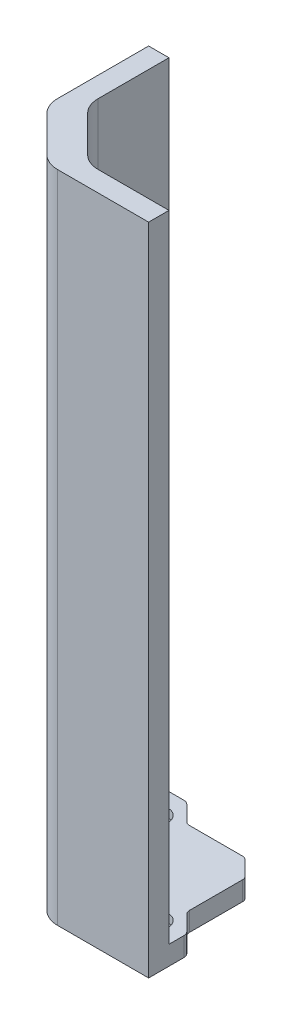
ISO-10303-21;
HEADER;
FILE_DESCRIPTION(('STEP AP214'),'2;1');
FILE_NAME('part.step','',(''),(''),'','','');
FILE_SCHEMA(('AUTOMOTIVE_DESIGN { 1 0 10303 214 1 1 1 1 }'));
ENDSEC;
DATA;
#1=APPLICATION_CONTEXT('core data for automotive mechanical design processes');
#2=APPLICATION_PROTOCOL_DEFINITION('international standard','automotive_design',2000,#1);
#3=PRODUCT_CONTEXT('',#1,'mechanical');
#4=PRODUCT('Part','Part','',(#3));
#5=PRODUCT_RELATED_PRODUCT_CATEGORY('part','',(#4));
#6=PRODUCT_DEFINITION_FORMATION('','',#4);
#7=PRODUCT_DEFINITION_CONTEXT('part definition',#1,'design');
#8=PRODUCT_DEFINITION('design','',#6,#7);
#9=PRODUCT_DEFINITION_SHAPE('','',#8);
#10=(LENGTH_UNIT() NAMED_UNIT(*) SI_UNIT(.MILLI.,.METRE.));
#11=(NAMED_UNIT(*) PLANE_ANGLE_UNIT() SI_UNIT($,.RADIAN.));
#12=(NAMED_UNIT(*) SI_UNIT($,.STERADIAN.) SOLID_ANGLE_UNIT());
#13=UNCERTAINTY_MEASURE_WITH_UNIT(LENGTH_MEASURE(1.E-05),#10,'distance_accuracy_value','');
#14=(GEOMETRIC_REPRESENTATION_CONTEXT(3) GLOBAL_UNCERTAINTY_ASSIGNED_CONTEXT((#13)) GLOBAL_UNIT_ASSIGNED_CONTEXT((#10,
#11,#12)) REPRESENTATION_CONTEXT('',''));
#15=CARTESIAN_POINT('',(0.,0.,0.));
#16=DIRECTION('',(0.,0.,1.));
#17=DIRECTION('',(1.,0.,0.));
#18=AXIS2_PLACEMENT_3D('',#15,#16,#17);
#19=CARTESIAN_POINT('',(0.,7.5,0.));
#20=DIRECTION('',(0.,-1.,0.));
#21=DIRECTION('',(0.,0.,-1.));
#22=AXIS2_PLACEMENT_3D('',#19,#20,#21);
#23=PLANE('',#22);
#24=CARTESIAN_POINT('',(13.4,7.5,-49.1879059907883));
#25=DIRECTION('',(0.,1.,0.));
#26=DIRECTION('',(0.,0.,1.));
#27=AXIS2_PLACEMENT_3D('',#24,#25,#26);
#28=CIRCLE('',#27,5.);
#29=CARTESIAN_POINT('',(13.4,7.5,-44.1879059907883));
#30=VERTEX_POINT('',#29);
#31=EDGE_CURVE('E950',#30,#30,#28,.T.);
#32=ORIENTED_EDGE('',*,*,#31,.F.);
#33=EDGE_LOOP('',(#32));
#34=FACE_BOUND('',#33,.T.);
#35=CARTESIAN_POINT('',(13.4,7.5,-36.5999999999999));
#36=DIRECTION('',(0.,1.,0.));
#37=DIRECTION('',(0.,0.,1.));
#38=AXIS2_PLACEMENT_3D('',#35,#36,#37);
#39=CIRCLE('',#38,5.);
#40=CARTESIAN_POINT('',(13.4,7.5,-31.5999999999999));
#41=VERTEX_POINT('',#40);
#42=EDGE_CURVE('E410',#41,#41,#39,.T.);
#43=ORIENTED_EDGE('',*,*,#42,.F.);
#44=EDGE_LOOP('',(#43));
#45=FACE_BOUND('',#44,.T.);
#46=CARTESIAN_POINT('',(36.5999999999999,7.5,-13.4));
#47=DIRECTION('',(0.,1.,0.));
#48=DIRECTION('',(0.,0.,1.));
#49=AXIS2_PLACEMENT_3D('',#46,#47,#48);
#50=CIRCLE('',#49,5.);
#51=CARTESIAN_POINT('',(36.5999999999999,7.5,-8.4));
#52=VERTEX_POINT('',#51);
#53=EDGE_CURVE('E403',#52,#52,#50,.T.);
#54=ORIENTED_EDGE('',*,*,#53,.F.);
#55=EDGE_LOOP('',(#54));
#56=FACE_BOUND('',#55,.T.);
#57=DIRECTION('',(-0.707106781186544,0.,-0.707106781186552));
#58=VECTOR('',#57,1.);
#59=CARTESIAN_POINT('',(8.,7.50000000000001,-28.0000000000001));
#60=LINE('',#59,#58);
#61=CARTESIAN_POINT('',(10.9289321881345,7.50000000000001,-25.0710678118656));
#62=VERTEX_POINT('',#61);
#63=CARTESIAN_POINT('',(25.0710678118654,7.50000000000001,-10.9289321881346));
#64=VERTEX_POINT('',#63);
#65=EDGE_CURVE('E356',#62,#64,#60,.F.);
#66=ORIENTED_EDGE('',*,*,#65,.T.);
#67=CARTESIAN_POINT('',(32.1421356237309,7.50000000000001,-18.));
#68=DIRECTION('',(0.,-1.,0.));
#69=DIRECTION('',(0.,0.,-1.));
#70=AXIS2_PLACEMENT_3D('',#67,#68,#69);
#71=CIRCLE('',#70,10.);
#72=CARTESIAN_POINT('',(32.1421356237309,7.5,-7.99999999999999));
#73=VERTEX_POINT('',#72);
#74=EDGE_CURVE('E387',#64,#73,#71,.F.);
#75=ORIENTED_EDGE('',*,*,#74,.T.);
#76=DIRECTION('',(-1.,0.,0.));
#77=VECTOR('',#76,1.);
#78=CARTESIAN_POINT('',(60.,7.5,-8.));
#79=LINE('',#78,#77);
#80=CARTESIAN_POINT('',(60.,7.5,-8.));
#81=VERTEX_POINT('',#80);
#82=EDGE_CURVE('E235',#81,#73,#79,.T.);
#83=ORIENTED_EDGE('',*,*,#82,.F.);
#84=DIRECTION('',(0.,0.,-1.));
#85=VECTOR('',#84,1.);
#86=CARTESIAN_POINT('',(60.,7.5,-15.));
#87=LINE('',#86,#85);
#88=CARTESIAN_POINT('',(60.,7.5,-13.9644660940673));
#89=VERTEX_POINT('',#88);
#90=EDGE_CURVE('E256',#81,#89,#87,.T.);
#91=ORIENTED_EDGE('',*,*,#90,.T.);
#92=CARTESIAN_POINT('',(57.5,7.5,-13.9644660940673));
#93=DIRECTION('',(0.,-1.,0.));
#94=DIRECTION('',(0.,0.,-1.));
#95=AXIS2_PLACEMENT_3D('',#92,#93,#94);
#96=CIRCLE('',#95,2.5);
#97=CARTESIAN_POINT('',(59.2677669529664,7.5,-15.7322330470336));
#98=VERTEX_POINT('',#97);
#99=EDGE_CURVE('E321',#89,#98,#96,.F.);
#100=ORIENTED_EDGE('',*,*,#99,.T.);
#101=DIRECTION('',(-0.707106781186548,0.,-0.707106781186548));
#102=VECTOR('',#101,1.);
#103=CARTESIAN_POINT('',(52.4999999999997,7.5,-22.5000000000003));
#104=LINE('',#103,#102);
#105=CARTESIAN_POINT('',(53.2322330470333,7.5,-21.7677669529666));
#106=VERTEX_POINT('',#105);
#107=EDGE_CURVE('E258',#98,#106,#104,.T.);
#108=ORIENTED_EDGE('',*,*,#107,.T.);
#109=CARTESIAN_POINT('',(54.9999999999997,7.5,-23.535533905933));
#110=DIRECTION('',(0.,-1.,0.));
#111=DIRECTION('',(0.,0.,-1.));
#112=AXIS2_PLACEMENT_3D('',#109,#110,#111);
#113=CIRCLE('',#112,2.5);
#114=CARTESIAN_POINT('',(52.4999999999997,7.5,-23.535533905933));
#115=VERTEX_POINT('',#114);
#116=EDGE_CURVE('E347',#106,#115,#113,.T.);
#117=ORIENTED_EDGE('',*,*,#116,.T.);
#118=DIRECTION('',(0.,0.,-1.));
#119=VECTOR('',#118,1.);
#120=CARTESIAN_POINT('',(52.4999999999997,7.5,-45.4289321881348));
#121=LINE('',#120,#119);
#122=CARTESIAN_POINT('',(52.4999999999997,7.5,-44.3933982822021));
#123=VERTEX_POINT('',#122);
#124=EDGE_CURVE('E262',#115,#123,#121,.T.);
#125=ORIENTED_EDGE('',*,*,#124,.T.);
#126=CARTESIAN_POINT('',(49.9999999999997,7.5,-44.3933982822021));
#127=DIRECTION('',(0.,-1.,0.));
#128=DIRECTION('',(0.,0.,-1.));
#129=AXIS2_PLACEMENT_3D('',#126,#127,#128);
#130=CIRCLE('',#129,2.5);
#131=CARTESIAN_POINT('',(51.7677669529661,7.5,-46.1611652351685));
#132=VERTEX_POINT('',#131);
#133=EDGE_CURVE('E317',#123,#132,#130,.F.);
#134=ORIENTED_EDGE('',*,*,#133,.T.);
#135=DIRECTION('',(-0.707106781186552,0.,-0.707106781186543));
#136=VECTOR('',#135,1.);
#137=CARTESIAN_POINT('',(45.4289321881342,7.5,-52.5000000000003));
#138=LINE('',#137,#136);
#139=CARTESIAN_POINT('',(46.1611652351678,7.5,-51.7677669529667));
#140=VERTEX_POINT('',#139);
#141=EDGE_CURVE('E265',#132,#140,#138,.T.);
#142=ORIENTED_EDGE('',*,*,#141,.T.);
#143=CARTESIAN_POINT('',(44.3933982822015,7.5,-50.0000000000003));
#144=DIRECTION('',(0.,-1.,0.));
#145=DIRECTION('',(0.,0.,-1.));
#146=AXIS2_PLACEMENT_3D('',#143,#144,#145);
#147=CIRCLE('',#146,2.5);
#148=CARTESIAN_POINT('',(44.3933982822015,7.5,-52.5000000000003));
#149=VERTEX_POINT('',#148);
#150=EDGE_CURVE('E323',#140,#149,#147,.F.);
#151=ORIENTED_EDGE('',*,*,#150,.T.);
#152=DIRECTION('',(-1.,0.,0.));
#153=VECTOR('',#152,1.);
#154=CARTESIAN_POINT('',(22.4999999999997,7.5,-52.5000000000003));
#155=LINE('',#154,#153);
#156=CARTESIAN_POINT('',(23.5355339059324,7.5,-52.5000000000003));
#157=VERTEX_POINT('',#156);
#158=EDGE_CURVE('E268',#149,#157,#155,.T.);
#159=ORIENTED_EDGE('',*,*,#158,.T.);
#160=CARTESIAN_POINT('',(23.5355339059324,7.5,-55.0000000000003));
#161=DIRECTION('',(0.,-1.,0.));
#162=DIRECTION('',(0.,0.,-1.));
#163=AXIS2_PLACEMENT_3D('',#160,#161,#162);
#164=CIRCLE('',#163,2.5);
#165=CARTESIAN_POINT('',(21.7677669529661,7.5,-53.2322330470339));
#166=VERTEX_POINT('',#165);
#167=EDGE_CURVE('E351',#157,#166,#164,.T.);
#168=ORIENTED_EDGE('',*,*,#167,.T.);
#169=DIRECTION('',(-0.707106781186547,0.,-0.707106781186547));
#170=VECTOR('',#169,1.);
#171=CARTESIAN_POINT('',(15.,7.5,-60.));
#172=LINE('',#171,#170);
#173=CARTESIAN_POINT('',(15.7322330470336,7.5,-59.2677669529664));
#174=VERTEX_POINT('',#173);
#175=EDGE_CURVE('E271',#166,#174,#172,.T.);
#176=ORIENTED_EDGE('',*,*,#175,.T.);
#177=CARTESIAN_POINT('',(13.9644660940673,7.5,-57.5));
#178=DIRECTION('',(0.,-1.,0.));
#179=DIRECTION('',(0.,0.,-1.));
#180=AXIS2_PLACEMENT_3D('',#177,#178,#179);
#181=CIRCLE('',#180,2.5);
#182=CARTESIAN_POINT('',(13.9644660940673,7.5,-60.));
#183=VERTEX_POINT('',#182);
#184=EDGE_CURVE('E319',#174,#183,#181,.F.);
#185=ORIENTED_EDGE('',*,*,#184,.T.);
#186=DIRECTION('',(-1.,0.,0.));
#187=VECTOR('',#186,1.);
#188=CARTESIAN_POINT('',(0.,7.5,-60.));
#189=LINE('',#188,#187);
#190=CARTESIAN_POINT('',(8.,7.5,-60.));
#191=VERTEX_POINT('',#190);
#192=EDGE_CURVE('E218',#183,#191,#189,.T.);
#193=ORIENTED_EDGE('',*,*,#192,.T.);
#194=DIRECTION('',(0.,0.,-1.));
#195=VECTOR('',#194,1.);
#196=CARTESIAN_POINT('',(8.,7.5,-7.99999999999999));
#197=LINE('',#196,#195);
#198=CARTESIAN_POINT('',(8.,7.5,-32.142135623731));
#199=VERTEX_POINT('',#198);
#200=EDGE_CURVE('E233',#199,#191,#197,.T.);
#201=ORIENTED_EDGE('',*,*,#200,.F.);
#202=CARTESIAN_POINT('',(18.,7.50000000000001,-32.142135623731));
#203=DIRECTION('',(0.,-1.,0.));
#204=DIRECTION('',(0.,0.,-1.));
#205=AXIS2_PLACEMENT_3D('',#202,#203,#204);
#206=CIRCLE('',#205,10.);
#207=EDGE_CURVE('E56',#199,#62,#206,.F.);
#208=ORIENTED_EDGE('',*,*,#207,.T.);
#209=EDGE_LOOP('',(#66,#75,#83,#91,#100,#108,#117,#125,#134,#142,#151,#159,#168,#176,#185,#193,
#201,#208));
#210=FACE_BOUND('',#209,.T.);
#211=CARTESIAN_POINT('',(49.1879059907883,7.5,-13.4));
#212=DIRECTION('',(0.,1.,0.));
#213=DIRECTION('',(0.,0.,1.));
#214=AXIS2_PLACEMENT_3D('',#211,#212,#213);
#215=CIRCLE('',#214,5.);
#216=CARTESIAN_POINT('',(49.1879059907883,7.5,-8.4));
#217=VERTEX_POINT('',#216);
#218=EDGE_CURVE('E399',#217,#217,#215,.T.);
#219=ORIENTED_EDGE('',*,*,#218,.F.);
#220=EDGE_LOOP('',(#219));
#221=FACE_BOUND('',#220,.T.);
#222=ADVANCED_FACE('F39',(#34,#45,#56,#210,#221),#23,.F.);
#223=CARTESIAN_POINT('',(60.,7.5,0.));
#224=DIRECTION('',(0.,0.,-1.));
#225=DIRECTION('',(-1.,0.,0.));
#226=AXIS2_PLACEMENT_3D('',#223,#224,#225);
#227=PLANE('',#226);
#228=DIRECTION('',(1.,0.,0.));
#229=VECTOR('',#228,1.);
#230=CARTESIAN_POINT('',(0.,257.5,0.));
#231=LINE('',#230,#229);
#232=CARTESIAN_POINT('',(24.1421356237309,257.5,0.));
#233=VERTEX_POINT('',#232);
#234=CARTESIAN_POINT('',(60.,257.5,0.));
#235=VERTEX_POINT('',#234);
#236=EDGE_CURVE('E227',#233,#235,#231,.T.);
#237=ORIENTED_EDGE('',*,*,#236,.F.);
#238=DIRECTION('',(0.,1.,0.));
#239=VECTOR('',#238,1.);
#240=CARTESIAN_POINT('',(24.1421356237309,0.,0.));
#241=LINE('',#240,#239);
#242=CARTESIAN_POINT('',(24.1421356237309,0.,0.));
#243=VERTEX_POINT('',#242);
#244=EDGE_CURVE('E377',#233,#243,#241,.F.);
#245=ORIENTED_EDGE('',*,*,#244,.T.);
#246=DIRECTION('',(1.,0.,0.));
#247=VECTOR('',#246,1.);
#248=CARTESIAN_POINT('',(60.,0.,0.));
#249=LINE('',#248,#247);
#250=CARTESIAN_POINT('',(60.,0.,0.));
#251=VERTEX_POINT('',#250);
#252=EDGE_CURVE('E255',#243,#251,#249,.T.);
#253=ORIENTED_EDGE('',*,*,#252,.T.);
#254=DIRECTION('',(0.,-1.,0.));
#255=VECTOR('',#254,1.);
#256=CARTESIAN_POINT('',(60.,7.5,0.));
#257=LINE('',#256,#255);
#258=EDGE_CURVE('E217',#235,#251,#257,.T.);
#259=ORIENTED_EDGE('',*,*,#258,.F.);
#260=EDGE_LOOP('',(#237,#245,#253,#259));
#261=FACE_BOUND('',#260,.T.);
#262=ADVANCED_FACE('F453',(#261),#227,.F.);
#263=CARTESIAN_POINT('',(60.,7.5,-15.));
#264=DIRECTION('',(-1.,0.,0.));
#265=DIRECTION('',(0.,0.,1.));
#266=AXIS2_PLACEMENT_3D('',#263,#264,#265);
#267=PLANE('',#266);
#268=DIRECTION('',(0.,0.,-1.));
#269=VECTOR('',#268,1.);
#270=CARTESIAN_POINT('',(60.,0.,-15.));
#271=LINE('',#270,#269);
#272=CARTESIAN_POINT('',(60.,0.,-13.9644660940673));
#273=VERTEX_POINT('',#272);
#274=EDGE_CURVE('E277',#251,#273,#271,.T.);
#275=ORIENTED_EDGE('',*,*,#274,.T.);
#276=DIRECTION('',(0.,-1.,0.));
#277=VECTOR('',#276,1.);
#278=CARTESIAN_POINT('',(60.,7.5,-13.9644660940673));
#279=LINE('',#278,#277);
#280=EDGE_CURVE('E330',#273,#89,#279,.F.);
#281=ORIENTED_EDGE('',*,*,#280,.T.);
#282=ORIENTED_EDGE('',*,*,#90,.F.);
#283=DIRECTION('',(0.,-1.,0.));
#284=VECTOR('',#283,1.);
#285=CARTESIAN_POINT('',(60.,257.5,-8.));
#286=LINE('',#285,#284);
#287=CARTESIAN_POINT('',(60.,257.5,-8.));
#288=VERTEX_POINT('',#287);
#289=EDGE_CURVE('E252',#288,#81,#286,.T.);
#290=ORIENTED_EDGE('',*,*,#289,.F.);
#291=DIRECTION('',(0.,0.,-1.));
#292=VECTOR('',#291,1.);
#293=CARTESIAN_POINT('',(60.,257.5,0.));
#294=LINE('',#293,#292);
#295=EDGE_CURVE('E242',#235,#288,#294,.T.);
#296=ORIENTED_EDGE('',*,*,#295,.F.);
#297=ORIENTED_EDGE('',*,*,#258,.T.);
#298=EDGE_LOOP('',(#275,#281,#282,#290,#296,#297));
#299=FACE_BOUND('',#298,.T.);
#300=ADVANCED_FACE('F459',(#299),#267,.F.);
#301=CARTESIAN_POINT('',(52.4999999999997,7.5,-22.5000000000003));
#302=DIRECTION('',(-0.707106781186547,0.,0.707106781186547));
#303=DIRECTION('',(0.707106781186548,0.,0.707106781186548));
#304=AXIS2_PLACEMENT_3D('',#301,#302,#303);
#305=PLANE('',#304);
#306=ORIENTED_EDGE('',*,*,#107,.F.);
#307=DIRECTION('',(0.,-1.,0.));
#308=VECTOR('',#307,1.);
#309=CARTESIAN_POINT('',(59.2677669529664,7.5,-15.7322330470336));
#310=LINE('',#309,#308);
#311=CARTESIAN_POINT('',(59.2677669529664,0.,-15.7322330470336));
#312=VERTEX_POINT('',#311);
#313=EDGE_CURVE('E327',#98,#312,#310,.T.);
#314=ORIENTED_EDGE('',*,*,#313,.T.);
#315=DIRECTION('',(-0.707106781186548,0.,-0.707106781186548));
#316=VECTOR('',#315,1.);
#317=CARTESIAN_POINT('',(52.4999999999997,0.,-22.5000000000003));
#318=LINE('',#317,#316);
#319=CARTESIAN_POINT('',(53.2322330470333,0.,-21.7677669529666));
#320=VERTEX_POINT('',#319);
#321=EDGE_CURVE('E280',#312,#320,#318,.T.);
#322=ORIENTED_EDGE('',*,*,#321,.T.);
#323=DIRECTION('',(0.,-1.,0.));
#324=VECTOR('',#323,1.);
#325=CARTESIAN_POINT('',(53.2322330470333,7.5,-21.7677669529666));
#326=LINE('',#325,#324);
#327=EDGE_CURVE('E325',#320,#106,#326,.F.);
#328=ORIENTED_EDGE('',*,*,#327,.T.);
#329=EDGE_LOOP('',(#306,#314,#322,#328));
#330=FACE_BOUND('',#329,.T.);
#331=ADVANCED_FACE('F491',(#330),#305,.F.);
#332=CARTESIAN_POINT('',(52.4999999999997,7.5,-45.4289321881348));
#333=DIRECTION('',(-1.,0.,0.));
#334=DIRECTION('',(0.,0.,1.));
#335=AXIS2_PLACEMENT_3D('',#332,#333,#334);
#336=PLANE('',#335);
#337=ORIENTED_EDGE('',*,*,#124,.F.);
#338=DIRECTION('',(0.,-1.,0.));
#339=VECTOR('',#338,1.);
#340=CARTESIAN_POINT('',(52.4999999999997,0.,-23.535533905933));
#341=LINE('',#340,#339);
#342=CARTESIAN_POINT('',(52.4999999999997,0.,-23.535533905933));
#343=VERTEX_POINT('',#342);
#344=EDGE_CURVE('E335',#115,#343,#341,.T.);
#345=ORIENTED_EDGE('',*,*,#344,.T.);
#346=DIRECTION('',(0.,0.,-1.));
#347=VECTOR('',#346,1.);
#348=CARTESIAN_POINT('',(52.4999999999997,0.,-45.4289321881348));
#349=LINE('',#348,#347);
#350=CARTESIAN_POINT('',(52.4999999999997,0.,-44.3933982822021));
#351=VERTEX_POINT('',#350);
#352=EDGE_CURVE('E283',#343,#351,#349,.T.);
#353=ORIENTED_EDGE('',*,*,#352,.T.);
#354=DIRECTION('',(0.,-1.,0.));
#355=VECTOR('',#354,1.);
#356=CARTESIAN_POINT('',(52.4999999999997,7.5,-44.3933982822021));
#357=LINE('',#356,#355);
#358=EDGE_CURVE('E333',#351,#123,#357,.F.);
#359=ORIENTED_EDGE('',*,*,#358,.T.);
#360=EDGE_LOOP('',(#337,#345,#353,#359));
#361=FACE_BOUND('',#360,.T.);
#362=ADVANCED_FACE('F487',(#361),#336,.F.);
#363=CARTESIAN_POINT('',(45.4289321881342,7.5,-52.5000000000003));
#364=DIRECTION('',(-0.707106781186543,0.,0.707106781186552));
#365=DIRECTION('',(0.707106781186552,0.,0.707106781186543));
#366=AXIS2_PLACEMENT_3D('',#363,#364,#365);
#367=PLANE('',#366);
#368=DIRECTION('',(-0.707106781186552,0.,-0.707106781186543));
#369=VECTOR('',#368,1.);
#370=CARTESIAN_POINT('',(45.4289321881342,0.,-52.5000000000003));
#371=LINE('',#370,#369);
#372=CARTESIAN_POINT('',(51.7677669529661,0.,-46.1611652351685));
#373=VERTEX_POINT('',#372);
#374=CARTESIAN_POINT('',(46.1611652351678,0.,-51.7677669529667));
#375=VERTEX_POINT('',#374);
#376=EDGE_CURVE('E286',#373,#375,#371,.T.);
#377=ORIENTED_EDGE('',*,*,#376,.T.);
#378=DIRECTION('',(0.,-1.,0.));
#379=VECTOR('',#378,1.);
#380=CARTESIAN_POINT('',(46.1611652351678,7.5,-51.7677669529667));
#381=LINE('',#380,#379);
#382=EDGE_CURVE('E315',#375,#140,#381,.F.);
#383=ORIENTED_EDGE('',*,*,#382,.T.);
#384=ORIENTED_EDGE('',*,*,#141,.F.);
#385=DIRECTION('',(0.,-1.,0.));
#386=VECTOR('',#385,1.);
#387=CARTESIAN_POINT('',(51.7677669529661,7.5,-46.1611652351685));
#388=LINE('',#387,#386);
#389=EDGE_CURVE('E312',#132,#373,#388,.T.);
#390=ORIENTED_EDGE('',*,*,#389,.T.);
#391=EDGE_LOOP('',(#377,#383,#384,#390));
#392=FACE_BOUND('',#391,.T.);
#393=ADVANCED_FACE('F483',(#392),#367,.F.);
#394=CARTESIAN_POINT('',(22.4999999999997,7.5,-52.5000000000003));
#395=DIRECTION('',(0.,0.,1.));
#396=DIRECTION('',(1.,0.,0.));
#397=AXIS2_PLACEMENT_3D('',#394,#395,#396);
#398=PLANE('',#397);
#399=ORIENTED_EDGE('',*,*,#158,.F.);
#400=DIRECTION('',(0.,-1.,0.));
#401=VECTOR('',#400,1.);
#402=CARTESIAN_POINT('',(44.3933982822015,7.5,-52.5000000000003));
#403=LINE('',#402,#401);
#404=CARTESIAN_POINT('',(44.3933982822015,0.,-52.5000000000003));
#405=VERTEX_POINT('',#404);
#406=EDGE_CURVE('E301',#149,#405,#403,.T.);
#407=ORIENTED_EDGE('',*,*,#406,.T.);
#408=DIRECTION('',(-1.,0.,0.));
#409=VECTOR('',#408,1.);
#410=CARTESIAN_POINT('',(22.4999999999997,0.,-52.5000000000003));
#411=LINE('',#410,#409);
#412=CARTESIAN_POINT('',(23.5355339059324,0.,-52.5000000000003));
#413=VERTEX_POINT('',#412);
#414=EDGE_CURVE('E289',#405,#413,#411,.T.);
#415=ORIENTED_EDGE('',*,*,#414,.T.);
#416=DIRECTION('',(0.,-1.,0.));
#417=VECTOR('',#416,1.);
#418=CARTESIAN_POINT('',(23.5355339059324,7.5,-52.5000000000003));
#419=LINE('',#418,#417);
#420=EDGE_CURVE('E299',#413,#157,#419,.F.);
#421=ORIENTED_EDGE('',*,*,#420,.T.);
#422=EDGE_LOOP('',(#399,#407,#415,#421));
#423=FACE_BOUND('',#422,.T.);
#424=ADVANCED_FACE('F479',(#423),#398,.F.);
#425=CARTESIAN_POINT('',(15.,7.5,-60.));
#426=DIRECTION('',(-0.707106781186547,0.,0.707106781186547));
#427=DIRECTION('',(0.707106781186548,0.,0.707106781186548));
#428=AXIS2_PLACEMENT_3D('',#425,#426,#427);
#429=PLANE('',#428);
#430=DIRECTION('',(-0.707106781186547,0.,-0.707106781186547));
#431=VECTOR('',#430,1.);
#432=CARTESIAN_POINT('',(15.,0.,-60.));
#433=LINE('',#432,#431);
#434=CARTESIAN_POINT('',(21.7677669529661,0.,-53.2322330470339));
#435=VERTEX_POINT('',#434);
#436=CARTESIAN_POINT('',(15.7322330470336,0.,-59.2677669529664));
#437=VERTEX_POINT('',#436);
#438=EDGE_CURVE('E292',#435,#437,#433,.T.);
#439=ORIENTED_EDGE('',*,*,#438,.T.);
#440=DIRECTION('',(0.,-1.,0.));
#441=VECTOR('',#440,1.);
#442=CARTESIAN_POINT('',(15.7322330470336,7.5,-59.2677669529664));
#443=LINE('',#442,#441);
#444=EDGE_CURVE('E343',#437,#174,#443,.F.);
#445=ORIENTED_EDGE('',*,*,#444,.T.);
#446=ORIENTED_EDGE('',*,*,#175,.F.);
#447=DIRECTION('',(0.,-1.,0.));
#448=VECTOR('',#447,1.);
#449=CARTESIAN_POINT('',(21.7677669529661,0.,-53.2322330470339));
#450=LINE('',#449,#448);
#451=EDGE_CURVE('E340',#166,#435,#450,.T.);
#452=ORIENTED_EDGE('',*,*,#451,.T.);
#453=EDGE_LOOP('',(#439,#445,#446,#452));
#454=FACE_BOUND('',#453,.T.);
#455=ADVANCED_FACE('F476',(#454),#429,.F.);
#456=CARTESIAN_POINT('',(0.,7.5,-60.));
#457=DIRECTION('',(0.,0.,1.));
#458=DIRECTION('',(1.,0.,0.));
#459=AXIS2_PLACEMENT_3D('',#456,#457,#458);
#460=PLANE('',#459);
#461=ORIENTED_EDGE('',*,*,#192,.F.);
#462=DIRECTION('',(0.,-1.,0.));
#463=VECTOR('',#462,1.);
#464=CARTESIAN_POINT('',(13.9644660940673,7.5,-60.));
#465=LINE('',#464,#463);
#466=CARTESIAN_POINT('',(13.9644660940673,0.,-60.));
#467=VERTEX_POINT('',#466);
#468=EDGE_CURVE('E338',#183,#467,#465,.T.);
#469=ORIENTED_EDGE('',*,*,#468,.T.);
#470=DIRECTION('',(-1.,0.,0.));
#471=VECTOR('',#470,1.);
#472=CARTESIAN_POINT('',(0.,0.,-60.));
#473=LINE('',#472,#471);
#474=CARTESIAN_POINT('',(0.,0.,-60.));
#475=VERTEX_POINT('',#474);
#476=EDGE_CURVE('E213',#467,#475,#473,.T.);
#477=ORIENTED_EDGE('',*,*,#476,.T.);
#478=DIRECTION('',(0.,-1.,0.));
#479=VECTOR('',#478,1.);
#480=CARTESIAN_POINT('',(0.,7.5,-60.));
#481=LINE('',#480,#479);
#482=CARTESIAN_POINT('',(0.,257.5,-60.));
#483=VERTEX_POINT('',#482);
#484=EDGE_CURVE('E204',#483,#475,#481,.T.);
#485=ORIENTED_EDGE('',*,*,#484,.F.);
#486=DIRECTION('',(-1.,0.,0.));
#487=VECTOR('',#486,1.);
#488=CARTESIAN_POINT('',(8.,257.5,-60.));
#489=LINE('',#488,#487);
#490=CARTESIAN_POINT('',(8.,257.5,-60.));
#491=VERTEX_POINT('',#490);
#492=EDGE_CURVE('E210',#491,#483,#489,.T.);
#493=ORIENTED_EDGE('',*,*,#492,.F.);
#494=DIRECTION('',(0.,-1.,0.));
#495=VECTOR('',#494,1.);
#496=CARTESIAN_POINT('',(8.,257.5,-60.));
#497=LINE('',#496,#495);
#498=EDGE_CURVE('E248',#491,#191,#497,.T.);
#499=ORIENTED_EDGE('',*,*,#498,.T.);
#500=EDGE_LOOP('',(#461,#469,#477,#485,#493,#499));
#501=FACE_BOUND('',#500,.T.);
#502=ADVANCED_FACE('F207',(#501),#460,.F.);
#503=CARTESIAN_POINT('',(0.,7.5,0.));
#504=DIRECTION('',(1.,0.,0.));
#505=DIRECTION('',(0.,0.,-1.));
#506=AXIS2_PLACEMENT_3D('',#503,#504,#505);
#507=PLANE('',#506);
#508=DIRECTION('',(0.,0.,1.));
#509=VECTOR('',#508,1.);
#510=CARTESIAN_POINT('',(0.,0.,0.));
#511=LINE('',#510,#509);
#512=CARTESIAN_POINT('',(0.,0.,-24.142135623731));
#513=VERTEX_POINT('',#512);
#514=EDGE_CURVE('E259',#475,#513,#511,.T.);
#515=ORIENTED_EDGE('',*,*,#514,.T.);
#516=DIRECTION('',(0.,-1.,0.));
#517=VECTOR('',#516,1.);
#518=CARTESIAN_POINT('',(0.,257.5,-24.142135623731));
#519=LINE('',#518,#517);
#520=CARTESIAN_POINT('',(0.,257.5,-24.142135623731));
#521=VERTEX_POINT('',#520);
#522=EDGE_CURVE('E225',#513,#521,#519,.F.);
#523=ORIENTED_EDGE('',*,*,#522,.T.);
#524=DIRECTION('',(0.,0.,1.));
#525=VECTOR('',#524,1.);
#526=CARTESIAN_POINT('',(0.,257.5,-60.));
#527=LINE('',#526,#525);
#528=EDGE_CURVE('E222',#483,#521,#527,.T.);
#529=ORIENTED_EDGE('',*,*,#528,.F.);
#530=ORIENTED_EDGE('',*,*,#484,.T.);
#531=EDGE_LOOP('',(#515,#523,#529,#530));
#532=FACE_BOUND('',#531,.T.);
#533=ADVANCED_FACE('F223',(#532),#507,.F.);
#534=CARTESIAN_POINT('',(0.,0.,0.));
#535=DIRECTION('',(0.,-1.,0.));
#536=DIRECTION('',(0.,0.,-1.));
#537=AXIS2_PLACEMENT_3D('',#534,#535,#536);
#538=PLANE('',#537);
#539=CARTESIAN_POINT('',(49.1879059907883,0.,-13.4));
#540=DIRECTION('',(0.,1.,0.));
#541=DIRECTION('',(0.,0.,1.));
#542=AXIS2_PLACEMENT_3D('',#539,#540,#541);
#543=CIRCLE('',#542,2.7);
#544=CARTESIAN_POINT('',(49.1879059907883,0.,-10.7));
#545=VERTEX_POINT('',#544);
#546=EDGE_CURVE('E427',#545,#545,#543,.T.);
#547=ORIENTED_EDGE('',*,*,#546,.T.);
#548=EDGE_LOOP('',(#547));
#549=FACE_BOUND('',#548,.T.);
#550=CARTESIAN_POINT('',(13.4,0.,-49.1879059907883));
#551=DIRECTION('',(0.,1.,0.));
#552=DIRECTION('',(0.,0.,-1.));
#553=AXIS2_PLACEMENT_3D('',#550,#551,#552);
#554=CIRCLE('',#553,2.69999999999999);
#555=CARTESIAN_POINT('',(13.4,0.,-51.8879059907883));
#556=VERTEX_POINT('',#555);
#557=EDGE_CURVE('E426',#556,#556,#554,.T.);
#558=ORIENTED_EDGE('',*,*,#557,.T.);
#559=EDGE_LOOP('',(#558));
#560=FACE_BOUND('',#559,.T.);
#561=CARTESIAN_POINT('',(13.4,0.,-36.5999999999999));
#562=DIRECTION('',(0.,1.,0.));
#563=DIRECTION('',(0.,0.,-1.));
#564=AXIS2_PLACEMENT_3D('',#561,#562,#563);
#565=CIRCLE('',#564,2.7);
#566=CARTESIAN_POINT('',(13.4,0.,-39.2999999999999));
#567=VERTEX_POINT('',#566);
#568=EDGE_CURVE('E395',#567,#567,#565,.T.);
#569=ORIENTED_EDGE('',*,*,#568,.T.);
#570=EDGE_LOOP('',(#569));
#571=FACE_BOUND('',#570,.T.);
#572=CARTESIAN_POINT('',(36.5999999999999,0.,-13.4));
#573=DIRECTION('',(0.,1.,0.));
#574=DIRECTION('',(0.,0.,1.));
#575=AXIS2_PLACEMENT_3D('',#572,#573,#574);
#576=CIRCLE('',#575,2.69999999999998);
#577=CARTESIAN_POINT('',(36.5999999999999,0.,-10.7));
#578=VERTEX_POINT('',#577);
#579=EDGE_CURVE('E238',#578,#578,#576,.T.);
#580=ORIENTED_EDGE('',*,*,#579,.T.);
#581=EDGE_LOOP('',(#580));
#582=FACE_BOUND('',#581,.T.);
#583=DIRECTION('',(0.707106781186546,0.,0.707106781186549));
#584=VECTOR('',#583,1.);
#585=CARTESIAN_POINT('',(10.,0.,-9.99999999999998));
#586=LINE('',#585,#584);
#587=CARTESIAN_POINT('',(17.0710678118654,0.,-2.92893218813454));
#588=VERTEX_POINT('',#587);
#589=CARTESIAN_POINT('',(2.92893218813451,0.,-17.0710678118655));
#590=VERTEX_POINT('',#589);
#591=EDGE_CURVE('E353',#588,#590,#586,.F.);
#592=ORIENTED_EDGE('',*,*,#591,.T.);
#593=CARTESIAN_POINT('',(10.,0.,-24.142135623731));
#594=DIRECTION('',(0.,-1.,0.));
#595=DIRECTION('',(0.,0.,-1.));
#596=AXIS2_PLACEMENT_3D('',#593,#594,#595);
#597=CIRCLE('',#596,10.);
#598=EDGE_CURVE('E375',#590,#513,#597,.T.);
#599=ORIENTED_EDGE('',*,*,#598,.T.);
#600=ORIENTED_EDGE('',*,*,#514,.F.);
#601=ORIENTED_EDGE('',*,*,#476,.F.);
#602=CARTESIAN_POINT('',(13.9644660940673,0.,-57.5));
#603=DIRECTION('',(0.,-1.,0.));
#604=DIRECTION('',(0.,0.,-1.));
#605=AXIS2_PLACEMENT_3D('',#602,#603,#604);
#606=CIRCLE('',#605,2.5);
#607=EDGE_CURVE('E306',#467,#437,#606,.T.);
#608=ORIENTED_EDGE('',*,*,#607,.T.);
#609=ORIENTED_EDGE('',*,*,#438,.F.);
#610=CARTESIAN_POINT('',(23.5355339059324,0.,-55.0000000000003));
#611=DIRECTION('',(0.,-1.,0.));
#612=DIRECTION('',(0.,0.,-1.));
#613=AXIS2_PLACEMENT_3D('',#610,#611,#612);
#614=CIRCLE('',#613,2.5);
#615=EDGE_CURVE('E349',#435,#413,#614,.F.);
#616=ORIENTED_EDGE('',*,*,#615,.T.);
#617=ORIENTED_EDGE('',*,*,#414,.F.);
#618=CARTESIAN_POINT('',(44.3933982822015,0.,-50.0000000000003));
#619=DIRECTION('',(0.,-1.,0.));
#620=DIRECTION('',(0.,0.,-1.));
#621=AXIS2_PLACEMENT_3D('',#618,#619,#620);
#622=CIRCLE('',#621,2.5);
#623=EDGE_CURVE('E310',#405,#375,#622,.T.);
#624=ORIENTED_EDGE('',*,*,#623,.T.);
#625=ORIENTED_EDGE('',*,*,#376,.F.);
#626=CARTESIAN_POINT('',(49.9999999999997,0.,-44.3933982822021));
#627=DIRECTION('',(0.,-1.,0.));
#628=DIRECTION('',(0.,0.,-1.));
#629=AXIS2_PLACEMENT_3D('',#626,#627,#628);
#630=CIRCLE('',#629,2.5);
#631=EDGE_CURVE('E304',#373,#351,#630,.T.);
#632=ORIENTED_EDGE('',*,*,#631,.T.);
#633=ORIENTED_EDGE('',*,*,#352,.F.);
#634=CARTESIAN_POINT('',(54.9999999999997,0.,-23.535533905933));
#635=DIRECTION('',(0.,-1.,0.));
#636=DIRECTION('',(0.,0.,-1.));
#637=AXIS2_PLACEMENT_3D('',#634,#635,#636);
#638=CIRCLE('',#637,2.5);
#639=EDGE_CURVE('E345',#343,#320,#638,.F.);
#640=ORIENTED_EDGE('',*,*,#639,.T.);
#641=ORIENTED_EDGE('',*,*,#321,.F.);
#642=CARTESIAN_POINT('',(57.5,0.,-13.9644660940673));
#643=DIRECTION('',(0.,-1.,0.));
#644=DIRECTION('',(0.,0.,-1.));
#645=AXIS2_PLACEMENT_3D('',#642,#643,#644);
#646=CIRCLE('',#645,2.5);
#647=EDGE_CURVE('E308',#312,#273,#646,.T.);
#648=ORIENTED_EDGE('',*,*,#647,.T.);
#649=ORIENTED_EDGE('',*,*,#274,.F.);
#650=ORIENTED_EDGE('',*,*,#252,.F.);
#651=CARTESIAN_POINT('',(24.1421356237309,0.,-10.));
#652=DIRECTION('',(0.,-1.,0.));
#653=DIRECTION('',(0.,0.,-1.));
#654=AXIS2_PLACEMENT_3D('',#651,#652,#653);
#655=CIRCLE('',#654,10.);
#656=EDGE_CURVE('E373',#243,#588,#655,.T.);
#657=ORIENTED_EDGE('',*,*,#656,.T.);
#658=EDGE_LOOP('',(#592,#599,#600,#601,#608,#609,#616,#617,#624,#625,#632,#633,#640,#641,#648,
#649,#650,#657));
#659=FACE_BOUND('',#658,.T.);
#660=ADVANCED_FACE('F432',(#549,#560,#571,#582,#659),#538,.T.);
#661=CARTESIAN_POINT('',(44.3933982822015,7.5,-50.0000000000003));
#662=DIRECTION('',(0.,-1.,0.));
#663=DIRECTION('',(0.,0.,-1.));
#664=AXIS2_PLACEMENT_3D('',#661,#662,#663);
#665=CYLINDRICAL_SURFACE('',#664,2.5);
#666=ORIENTED_EDGE('',*,*,#150,.F.);
#667=ORIENTED_EDGE('',*,*,#382,.F.);
#668=ORIENTED_EDGE('',*,*,#623,.F.);
#669=ORIENTED_EDGE('',*,*,#406,.F.);
#670=EDGE_LOOP('',(#666,#667,#668,#669));
#671=FACE_BOUND('',#670,.T.);
#672=ADVANCED_FACE('F470',(#671),#665,.T.);
#673=CARTESIAN_POINT('',(57.5,7.5,-13.9644660940673));
#674=DIRECTION('',(0.,-1.,0.));
#675=DIRECTION('',(0.,0.,-1.));
#676=AXIS2_PLACEMENT_3D('',#673,#674,#675);
#677=CYLINDRICAL_SURFACE('',#676,2.5);
#678=ORIENTED_EDGE('',*,*,#99,.F.);
#679=ORIENTED_EDGE('',*,*,#280,.F.);
#680=ORIENTED_EDGE('',*,*,#647,.F.);
#681=ORIENTED_EDGE('',*,*,#313,.F.);
#682=EDGE_LOOP('',(#678,#679,#680,#681));
#683=FACE_BOUND('',#682,.T.);
#684=ADVANCED_FACE('F501',(#683),#677,.T.);
#685=CARTESIAN_POINT('',(54.9999999999997,7.5,-23.535533905933));
#686=DIRECTION('',(0.,1.,0.));
#687=DIRECTION('',(0.,0.,1.));
#688=AXIS2_PLACEMENT_3D('',#685,#686,#687);
#689=CYLINDRICAL_SURFACE('',#688,2.5);
#690=ORIENTED_EDGE('',*,*,#116,.F.);
#691=ORIENTED_EDGE('',*,*,#327,.F.);
#692=ORIENTED_EDGE('',*,*,#639,.F.);
#693=ORIENTED_EDGE('',*,*,#344,.F.);
#694=EDGE_LOOP('',(#690,#691,#692,#693));
#695=FACE_BOUND('',#694,.T.);
#696=ADVANCED_FACE('F505',(#695),#689,.F.);
#697=CARTESIAN_POINT('',(13.9644660940673,7.5,-57.5));
#698=DIRECTION('',(0.,-1.,0.));
#699=DIRECTION('',(0.,0.,-1.));
#700=AXIS2_PLACEMENT_3D('',#697,#698,#699);
#701=CYLINDRICAL_SURFACE('',#700,2.5);
#702=ORIENTED_EDGE('',*,*,#184,.F.);
#703=ORIENTED_EDGE('',*,*,#444,.F.);
#704=ORIENTED_EDGE('',*,*,#607,.F.);
#705=ORIENTED_EDGE('',*,*,#468,.F.);
#706=EDGE_LOOP('',(#702,#703,#704,#705));
#707=FACE_BOUND('',#706,.T.);
#708=ADVANCED_FACE('F509',(#707),#701,.T.);
#709=CARTESIAN_POINT('',(23.5355339059324,7.5,-55.0000000000003));
#710=DIRECTION('',(0.,1.,0.));
#711=DIRECTION('',(0.,0.,1.));
#712=AXIS2_PLACEMENT_3D('',#709,#710,#711);
#713=CYLINDRICAL_SURFACE('',#712,2.5);
#714=ORIENTED_EDGE('',*,*,#167,.F.);
#715=ORIENTED_EDGE('',*,*,#420,.F.);
#716=ORIENTED_EDGE('',*,*,#615,.F.);
#717=ORIENTED_EDGE('',*,*,#451,.F.);
#718=EDGE_LOOP('',(#714,#715,#716,#717));
#719=FACE_BOUND('',#718,.T.);
#720=ADVANCED_FACE('F513',(#719),#713,.F.);
#721=CARTESIAN_POINT('',(49.9999999999997,7.5,-44.3933982822021));
#722=DIRECTION('',(0.,-1.,0.));
#723=DIRECTION('',(0.,0.,-1.));
#724=AXIS2_PLACEMENT_3D('',#721,#722,#723);
#725=CYLINDRICAL_SURFACE('',#724,2.5);
#726=ORIENTED_EDGE('',*,*,#133,.F.);
#727=ORIENTED_EDGE('',*,*,#358,.F.);
#728=ORIENTED_EDGE('',*,*,#631,.F.);
#729=ORIENTED_EDGE('',*,*,#389,.F.);
#730=EDGE_LOOP('',(#726,#727,#728,#729));
#731=FACE_BOUND('',#730,.T.);
#732=ADVANCED_FACE('F517',(#731),#725,.T.);
#733=CARTESIAN_POINT('',(60.,257.5,-8.));
#734=DIRECTION('',(0.,0.,1.));
#735=DIRECTION('',(1.,0.,0.));
#736=AXIS2_PLACEMENT_3D('',#733,#734,#735);
#737=PLANE('',#736);
#738=ORIENTED_EDGE('',*,*,#82,.T.);
#739=DIRECTION('',(0.,-1.,0.));
#740=VECTOR('',#739,1.);
#741=CARTESIAN_POINT('',(32.1421356237309,257.5,-7.99999999999999));
#742=LINE('',#741,#740);
#743=CARTESIAN_POINT('',(32.1421356237309,257.5,-7.99999999999999));
#744=VERTEX_POINT('',#743);
#745=EDGE_CURVE('E380',#73,#744,#742,.F.);
#746=ORIENTED_EDGE('',*,*,#745,.T.);
#747=DIRECTION('',(-1.,0.,0.));
#748=VECTOR('',#747,1.);
#749=CARTESIAN_POINT('',(60.,257.5,-8.));
#750=LINE('',#749,#748);
#751=EDGE_CURVE('E244',#288,#744,#750,.T.);
#752=ORIENTED_EDGE('',*,*,#751,.F.);
#753=ORIENTED_EDGE('',*,*,#289,.T.);
#754=EDGE_LOOP('',(#738,#746,#752,#753));
#755=FACE_BOUND('',#754,.T.);
#756=ADVANCED_FACE('F466',(#755),#737,.F.);
#757=CARTESIAN_POINT('',(8.,257.5,-7.99999999999999));
#758=DIRECTION('',(-1.,0.,0.));
#759=DIRECTION('',(0.,0.,1.));
#760=AXIS2_PLACEMENT_3D('',#757,#758,#759);
#761=PLANE('',#760);
#762=DIRECTION('',(0.,0.,-1.));
#763=VECTOR('',#762,1.);
#764=CARTESIAN_POINT('',(8.,257.5,-7.99999999999999));
#765=LINE('',#764,#763);
#766=CARTESIAN_POINT('',(8.,257.5,-32.142135623731));
#767=VERTEX_POINT('',#766);
#768=EDGE_CURVE('E231',#767,#491,#765,.T.);
#769=ORIENTED_EDGE('',*,*,#768,.F.);
#770=DIRECTION('',(0.,1.,0.));
#771=VECTOR('',#770,1.);
#772=CARTESIAN_POINT('',(8.,7.50000000000001,-32.142135623731));
#773=LINE('',#772,#771);
#774=EDGE_CURVE('E389',#767,#199,#773,.F.);
#775=ORIENTED_EDGE('',*,*,#774,.T.);
#776=ORIENTED_EDGE('',*,*,#200,.T.);
#777=ORIENTED_EDGE('',*,*,#498,.F.);
#778=EDGE_LOOP('',(#769,#775,#776,#777));
#779=FACE_BOUND('',#778,.T.);
#780=ADVANCED_FACE('F584',(#779),#761,.F.);
#781=CARTESIAN_POINT('',(0.,257.5,0.));
#782=DIRECTION('',(0.,1.,0.));
#783=DIRECTION('',(0.,0.,1.));
#784=AXIS2_PLACEMENT_3D('',#781,#782,#783);
#785=PLANE('',#784);
#786=ORIENTED_EDGE('',*,*,#528,.T.);
#787=CARTESIAN_POINT('',(10.,257.5,-24.142135623731));
#788=DIRECTION('',(0.,1.,0.));
#789=DIRECTION('',(0.,0.,1.));
#790=AXIS2_PLACEMENT_3D('',#787,#788,#789);
#791=CIRCLE('',#790,10.);
#792=CARTESIAN_POINT('',(2.92893218813451,257.5,-17.0710678118655));
#793=VERTEX_POINT('',#792);
#794=EDGE_CURVE('E367',#521,#793,#791,.T.);
#795=ORIENTED_EDGE('',*,*,#794,.T.);
#796=DIRECTION('',(-0.707106781186546,0.,-0.707106781186549));
#797=VECTOR('',#796,1.);
#798=CARTESIAN_POINT('',(10.,257.5,-9.99999999999998));
#799=LINE('',#798,#797);
#800=CARTESIAN_POINT('',(17.0710678118654,257.5,-2.92893218813454));
#801=VERTEX_POINT('',#800);
#802=EDGE_CURVE('E361',#793,#801,#799,.F.);
#803=ORIENTED_EDGE('',*,*,#802,.T.);
#804=CARTESIAN_POINT('',(24.1421356237309,257.5,-10.));
#805=DIRECTION('',(0.,1.,0.));
#806=DIRECTION('',(0.,0.,1.));
#807=AXIS2_PLACEMENT_3D('',#804,#805,#806);
#808=CIRCLE('',#807,10.);
#809=EDGE_CURVE('E365',#801,#233,#808,.T.);
#810=ORIENTED_EDGE('',*,*,#809,.T.);
#811=ORIENTED_EDGE('',*,*,#236,.T.);
#812=ORIENTED_EDGE('',*,*,#295,.T.);
#813=ORIENTED_EDGE('',*,*,#751,.T.);
#814=CARTESIAN_POINT('',(32.1421356237309,257.5,-18.));
#815=DIRECTION('',(0.,1.,0.));
#816=DIRECTION('',(0.,0.,1.));
#817=AXIS2_PLACEMENT_3D('',#814,#815,#816);
#818=CIRCLE('',#817,10.);
#819=CARTESIAN_POINT('',(25.0710678118654,257.5,-10.9289321881346));
#820=VERTEX_POINT('',#819);
#821=EDGE_CURVE('E48',#744,#820,#818,.F.);
#822=ORIENTED_EDGE('',*,*,#821,.T.);
#823=DIRECTION('',(0.707106781186544,0.,0.707106781186552));
#824=VECTOR('',#823,1.);
#825=CARTESIAN_POINT('',(8.,257.5,-28.0000000000001));
#826=LINE('',#825,#824);
#827=CARTESIAN_POINT('',(10.9289321881345,257.5,-25.0710678118656));
#828=VERTEX_POINT('',#827);
#829=EDGE_CURVE('E358',#820,#828,#826,.F.);
#830=ORIENTED_EDGE('',*,*,#829,.T.);
#831=CARTESIAN_POINT('',(18.,257.5,-32.142135623731));
#832=DIRECTION('',(0.,1.,0.));
#833=DIRECTION('',(0.,0.,1.));
#834=AXIS2_PLACEMENT_3D('',#831,#832,#833);
#835=CIRCLE('',#834,10.);
#836=EDGE_CURVE('E11',#828,#767,#835,.F.);
#837=ORIENTED_EDGE('',*,*,#836,.T.);
#838=ORIENTED_EDGE('',*,*,#768,.T.);
#839=ORIENTED_EDGE('',*,*,#492,.T.);
#840=EDGE_LOOP('',(#786,#795,#803,#810,#811,#812,#813,#822,#830,#837,#838,#839));
#841=FACE_BOUND('',#840,.T.);
#842=ADVANCED_FACE('F229',(#841),#785,.T.);
#843=CARTESIAN_POINT('',(20.,7.5,0.));
#844=DIRECTION('',(0.707106781186549,0.,-0.707106781186546));
#845=DIRECTION('',(0.,-1.,0.));
#846=AXIS2_PLACEMENT_3D('',#843,#844,#845);
#847=PLANE('',#846);
#848=ORIENTED_EDGE('',*,*,#802,.F.);
#849=DIRECTION('',(0.,1.,0.));
#850=VECTOR('',#849,1.);
#851=CARTESIAN_POINT('',(2.92893218813451,0.,-17.0710678118655));
#852=LINE('',#851,#850);
#853=EDGE_CURVE('E371',#793,#590,#852,.F.);
#854=ORIENTED_EDGE('',*,*,#853,.T.);
#855=ORIENTED_EDGE('',*,*,#591,.F.);
#856=DIRECTION('',(0.,-1.,0.));
#857=VECTOR('',#856,1.);
#858=CARTESIAN_POINT('',(17.0710678118654,257.5,-2.92893218813454));
#859=LINE('',#858,#857);
#860=EDGE_CURVE('E369',#588,#801,#859,.F.);
#861=ORIENTED_EDGE('',*,*,#860,.T.);
#862=EDGE_LOOP('',(#848,#854,#855,#861));
#863=FACE_BOUND('',#862,.T.);
#864=ADVANCED_FACE('F523',(#863),#847,.F.);
#865=CARTESIAN_POINT('',(8.,257.5,-28.0000000000001));
#866=DIRECTION('',(0.707106781186552,0.,-0.707106781186544));
#867=DIRECTION('',(0.,1.,0.));
#868=AXIS2_PLACEMENT_3D('',#865,#866,#867);
#869=PLANE('',#868);
#870=ORIENTED_EDGE('',*,*,#829,.F.);
#871=DIRECTION('',(0.,1.,0.));
#872=VECTOR('',#871,1.);
#873=CARTESIAN_POINT('',(25.0710678118654,7.50000000000001,-10.9289321881346));
#874=LINE('',#873,#872);
#875=EDGE_CURVE('E64',#820,#64,#874,.F.);
#876=ORIENTED_EDGE('',*,*,#875,.T.);
#877=ORIENTED_EDGE('',*,*,#65,.F.);
#878=DIRECTION('',(0.,-1.,0.));
#879=VECTOR('',#878,1.);
#880=CARTESIAN_POINT('',(10.9289321881345,257.5,-25.0710678118656));
#881=LINE('',#880,#879);
#882=EDGE_CURVE('E383',#62,#828,#881,.F.);
#883=ORIENTED_EDGE('',*,*,#882,.T.);
#884=EDGE_LOOP('',(#870,#876,#877,#883));
#885=FACE_BOUND('',#884,.T.);
#886=ADVANCED_FACE('F529',(#885),#869,.T.);
#887=CARTESIAN_POINT('',(10.,7.5,-24.142135623731));
#888=DIRECTION('',(0.,1.,0.));
#889=DIRECTION('',(0.,0.,1.));
#890=AXIS2_PLACEMENT_3D('',#887,#888,#889);
#891=CYLINDRICAL_SURFACE('',#890,10.);
#892=ORIENTED_EDGE('',*,*,#598,.F.);
#893=ORIENTED_EDGE('',*,*,#853,.F.);
#894=ORIENTED_EDGE('',*,*,#794,.F.);
#895=ORIENTED_EDGE('',*,*,#522,.F.);
#896=EDGE_LOOP('',(#892,#893,#894,#895));
#897=FACE_BOUND('',#896,.T.);
#898=ADVANCED_FACE('F535',(#897),#891,.T.);
#899=CARTESIAN_POINT('',(24.1421356237309,7.5,-10.));
#900=DIRECTION('',(0.,-1.,0.));
#901=DIRECTION('',(0.,0.,-1.));
#902=AXIS2_PLACEMENT_3D('',#899,#900,#901);
#903=CYLINDRICAL_SURFACE('',#902,10.);
#904=ORIENTED_EDGE('',*,*,#809,.F.);
#905=ORIENTED_EDGE('',*,*,#860,.F.);
#906=ORIENTED_EDGE('',*,*,#656,.F.);
#907=ORIENTED_EDGE('',*,*,#244,.F.);
#908=EDGE_LOOP('',(#904,#905,#906,#907));
#909=FACE_BOUND('',#908,.T.);
#910=ADVANCED_FACE('F538',(#909),#903,.T.);
#911=CARTESIAN_POINT('',(32.1421356237309,257.5,-18.));
#912=DIRECTION('',(0.,1.,0.));
#913=DIRECTION('',(0.,0.,1.));
#914=AXIS2_PLACEMENT_3D('',#911,#912,#913);
#915=CYLINDRICAL_SURFACE('',#914,10.);
#916=ORIENTED_EDGE('',*,*,#74,.F.);
#917=ORIENTED_EDGE('',*,*,#875,.F.);
#918=ORIENTED_EDGE('',*,*,#821,.F.);
#919=ORIENTED_EDGE('',*,*,#745,.F.);
#920=EDGE_LOOP('',(#916,#917,#918,#919));
#921=FACE_BOUND('',#920,.T.);
#922=ADVANCED_FACE('F541',(#921),#915,.F.);
#923=CARTESIAN_POINT('',(18.,257.5,-32.142135623731));
#924=DIRECTION('',(0.,-1.,0.));
#925=DIRECTION('',(0.,0.,-1.));
#926=AXIS2_PLACEMENT_3D('',#923,#924,#925);
#927=CYLINDRICAL_SURFACE('',#926,10.);
#928=ORIENTED_EDGE('',*,*,#836,.F.);
#929=ORIENTED_EDGE('',*,*,#882,.F.);
#930=ORIENTED_EDGE('',*,*,#207,.F.);
#931=ORIENTED_EDGE('',*,*,#774,.F.);
#932=EDGE_LOOP('',(#928,#929,#930,#931));
#933=FACE_BOUND('',#932,.T.);
#934=ADVANCED_FACE('F41',(#933),#927,.F.);
#935=CARTESIAN_POINT('',(36.5999999999999,0.,-13.4));
#936=DIRECTION('',(0.,1.,0.));
#937=DIRECTION('',(0.,0.,1.));
#938=AXIS2_PLACEMENT_3D('',#935,#936,#937);
#939=CYLINDRICAL_SURFACE('',#938,2.69999999999998);
#940=CARTESIAN_POINT('',(36.5999999999999,4.2,-13.4));
#941=DIRECTION('',(0.,-1.,0.));
#942=DIRECTION('',(0.,0.,-1.));
#943=AXIS2_PLACEMENT_3D('',#940,#941,#942);
#944=CIRCLE('',#943,2.69999999999998);
#945=CARTESIAN_POINT('',(36.5999999999999,4.2,-16.1));
#946=VERTEX_POINT('',#945);
#947=EDGE_CURVE('E397',#946,#946,#944,.F.);
#948=ORIENTED_EDGE('',*,*,#947,.T.);
#949=EDGE_LOOP('',(#948));
#950=FACE_BOUND('',#949,.T.);
#951=ORIENTED_EDGE('',*,*,#579,.F.);
#952=EDGE_LOOP('',(#951));
#953=FACE_BOUND('',#952,.T.);
#954=ADVANCED_FACE('F448',(#950,#953),#939,.F.);
#955=CARTESIAN_POINT('',(13.4,0.,-36.5999999999999));
#956=DIRECTION('',(0.,1.,0.));
#957=DIRECTION('',(0.,0.,1.));
#958=AXIS2_PLACEMENT_3D('',#955,#956,#957);
#959=CYLINDRICAL_SURFACE('',#958,2.7);
#960=CARTESIAN_POINT('',(13.4,4.2,-36.5999999999999));
#961=DIRECTION('',(0.,-1.,0.));
#962=DIRECTION('',(0.,0.,-1.));
#963=AXIS2_PLACEMENT_3D('',#960,#961,#962);
#964=CIRCLE('',#963,2.7);
#965=CARTESIAN_POINT('',(13.4,4.2,-39.2999999999999));
#966=VERTEX_POINT('',#965);
#967=EDGE_CURVE('E401',#966,#966,#964,.F.);
#968=ORIENTED_EDGE('',*,*,#967,.T.);
#969=EDGE_LOOP('',(#968));
#970=FACE_BOUND('',#969,.T.);
#971=ORIENTED_EDGE('',*,*,#568,.F.);
#972=EDGE_LOOP('',(#971));
#973=FACE_BOUND('',#972,.T.);
#974=ADVANCED_FACE('F438',(#970,#973),#959,.F.);
#975=CARTESIAN_POINT('',(13.4,0.,-49.1879059907883));
#976=DIRECTION('',(0.,1.,0.));
#977=DIRECTION('',(0.,0.,1.));
#978=AXIS2_PLACEMENT_3D('',#975,#976,#977);
#979=CYLINDRICAL_SURFACE('',#978,2.69999999999999);
#980=CARTESIAN_POINT('',(13.4,4.2,-49.1879059907883));
#981=DIRECTION('',(0.,-1.,0.));
#982=DIRECTION('',(0.,0.,-1.));
#983=AXIS2_PLACEMENT_3D('',#980,#981,#982);
#984=CIRCLE('',#983,2.69999999999999);
#985=CARTESIAN_POINT('',(13.4,4.2,-51.8879059907883));
#986=VERTEX_POINT('',#985);
#987=EDGE_CURVE('E43',#986,#986,#984,.F.);
#988=ORIENTED_EDGE('',*,*,#987,.T.);
#989=EDGE_LOOP('',(#988));
#990=FACE_BOUND('',#989,.T.);
#991=ORIENTED_EDGE('',*,*,#557,.F.);
#992=EDGE_LOOP('',(#991));
#993=FACE_BOUND('',#992,.T.);
#994=ADVANCED_FACE('F435',(#990,#993),#979,.F.);
#995=CARTESIAN_POINT('',(49.1879059907883,0.,-13.4));
#996=DIRECTION('',(0.,1.,0.));
#997=DIRECTION('',(0.,0.,1.));
#998=AXIS2_PLACEMENT_3D('',#995,#996,#997);
#999=CYLINDRICAL_SURFACE('',#998,2.7);
#1000=CARTESIAN_POINT('',(49.1879059907883,4.2,-13.4));
#1001=DIRECTION('',(0.,-1.,0.));
#1002=DIRECTION('',(0.,0.,-1.));
#1003=AXIS2_PLACEMENT_3D('',#1000,#1001,#1002);
#1004=CIRCLE('',#1003,2.7);
#1005=CARTESIAN_POINT('',(49.1879059907883,4.2,-16.1));
#1006=VERTEX_POINT('',#1005);
#1007=EDGE_CURVE('E392',#1006,#1006,#1004,.F.);
#1008=ORIENTED_EDGE('',*,*,#1007,.T.);
#1009=EDGE_LOOP('',(#1008));
#1010=FACE_BOUND('',#1009,.T.);
#1011=ORIENTED_EDGE('',*,*,#546,.F.);
#1012=EDGE_LOOP('',(#1011));
#1013=FACE_BOUND('',#1012,.T.);
#1014=ADVANCED_FACE('F437',(#1010,#1013),#999,.F.);
#1015=CARTESIAN_POINT('',(51.8379059907883,4.2,-13.4));
#1016=DIRECTION('',(0.,-1.,0.));
#1017=DIRECTION('',(0.,0.,-1.));
#1018=AXIS2_PLACEMENT_3D('',#1015,#1016,#1017);
#1019=PLANE('',#1018);
#1020=CARTESIAN_POINT('',(49.1879059907883,4.2,-13.4));
#1021=DIRECTION('',(0.,1.,0.));
#1022=DIRECTION('',(0.,0.,1.));
#1023=AXIS2_PLACEMENT_3D('',#1020,#1021,#1022);
#1024=CIRCLE('',#1023,5.);
#1025=CARTESIAN_POINT('',(49.1879059907883,4.2,-8.4));
#1026=VERTEX_POINT('',#1025);
#1027=EDGE_CURVE('E396',#1026,#1026,#1024,.T.);
#1028=ORIENTED_EDGE('',*,*,#1027,.T.);
#1029=EDGE_LOOP('',(#1028));
#1030=FACE_BOUND('',#1029,.T.);
#1031=ORIENTED_EDGE('',*,*,#1007,.F.);
#1032=EDGE_LOOP('',(#1031));
#1033=FACE_BOUND('',#1032,.T.);
#1034=ADVANCED_FACE('F445',(#1030,#1033),#1019,.F.);
#1035=CARTESIAN_POINT('',(49.1879059907883,7.5,-13.4));
#1036=DIRECTION('',(0.,1.,0.));
#1037=DIRECTION('',(0.,0.,1.));
#1038=AXIS2_PLACEMENT_3D('',#1035,#1036,#1037);
#1039=CYLINDRICAL_SURFACE('',#1038,5.);
#1040=ORIENTED_EDGE('',*,*,#1027,.F.);
#1041=EDGE_LOOP('',(#1040));
#1042=FACE_BOUND('',#1041,.T.);
#1043=ORIENTED_EDGE('',*,*,#218,.T.);
#1044=EDGE_LOOP('',(#1043));
#1045=FACE_BOUND('',#1044,.T.);
#1046=ADVANCED_FACE('F605',(#1042,#1045),#1039,.F.);
#1047=CARTESIAN_POINT('',(39.2499999999999,4.2,-13.4));
#1048=DIRECTION('',(0.,-1.,0.));
#1049=DIRECTION('',(0.,0.,-1.));
#1050=AXIS2_PLACEMENT_3D('',#1047,#1048,#1049);
#1051=PLANE('',#1050);
#1052=CARTESIAN_POINT('',(36.5999999999999,4.2,-13.4));
#1053=DIRECTION('',(0.,1.,0.));
#1054=DIRECTION('',(0.,0.,1.));
#1055=AXIS2_PLACEMENT_3D('',#1052,#1053,#1054);
#1056=CIRCLE('',#1055,5.);
#1057=CARTESIAN_POINT('',(36.5999999999999,4.2,-8.4));
#1058=VERTEX_POINT('',#1057);
#1059=EDGE_CURVE('E400',#1058,#1058,#1056,.T.);
#1060=ORIENTED_EDGE('',*,*,#1059,.T.);
#1061=EDGE_LOOP('',(#1060));
#1062=FACE_BOUND('',#1061,.T.);
#1063=ORIENTED_EDGE('',*,*,#947,.F.);
#1064=EDGE_LOOP('',(#1063));
#1065=FACE_BOUND('',#1064,.T.);
#1066=ADVANCED_FACE('F602',(#1062,#1065),#1051,.F.);
#1067=CARTESIAN_POINT('',(36.5999999999999,7.5,-13.4));
#1068=DIRECTION('',(0.,1.,0.));
#1069=DIRECTION('',(0.,0.,1.));
#1070=AXIS2_PLACEMENT_3D('',#1067,#1068,#1069);
#1071=CYLINDRICAL_SURFACE('',#1070,5.);
#1072=ORIENTED_EDGE('',*,*,#1059,.F.);
#1073=EDGE_LOOP('',(#1072));
#1074=FACE_BOUND('',#1073,.T.);
#1075=ORIENTED_EDGE('',*,*,#53,.T.);
#1076=EDGE_LOOP('',(#1075));
#1077=FACE_BOUND('',#1076,.T.);
#1078=ADVANCED_FACE('F604',(#1074,#1077),#1071,.F.);
#1079=CARTESIAN_POINT('',(16.05,4.2,-36.5999999999999));
#1080=DIRECTION('',(0.,-1.,0.));
#1081=DIRECTION('',(0.,0.,-1.));
#1082=AXIS2_PLACEMENT_3D('',#1079,#1080,#1081);
#1083=PLANE('',#1082);
#1084=CARTESIAN_POINT('',(13.4,4.2,-36.5999999999999));
#1085=DIRECTION('',(0.,1.,0.));
#1086=DIRECTION('',(0.,0.,1.));
#1087=AXIS2_PLACEMENT_3D('',#1084,#1085,#1086);
#1088=CIRCLE('',#1087,5.);
#1089=CARTESIAN_POINT('',(13.4,4.2,-31.5999999999999));
#1090=VERTEX_POINT('',#1089);
#1091=EDGE_CURVE('E404',#1090,#1090,#1088,.T.);
#1092=ORIENTED_EDGE('',*,*,#1091,.T.);
#1093=EDGE_LOOP('',(#1092));
#1094=FACE_BOUND('',#1093,.T.);
#1095=ORIENTED_EDGE('',*,*,#967,.F.);
#1096=EDGE_LOOP('',(#1095));
#1097=FACE_BOUND('',#1096,.T.);
#1098=ADVANCED_FACE('F612',(#1094,#1097),#1083,.F.);
#1099=CARTESIAN_POINT('',(13.4,7.5,-36.5999999999999));
#1100=DIRECTION('',(0.,1.,0.));
#1101=DIRECTION('',(0.,0.,1.));
#1102=AXIS2_PLACEMENT_3D('',#1099,#1100,#1101);
#1103=CYLINDRICAL_SURFACE('',#1102,5.);
#1104=ORIENTED_EDGE('',*,*,#1091,.F.);
#1105=EDGE_LOOP('',(#1104));
#1106=FACE_BOUND('',#1105,.T.);
#1107=ORIENTED_EDGE('',*,*,#42,.T.);
#1108=EDGE_LOOP('',(#1107));
#1109=FACE_BOUND('',#1108,.T.);
#1110=ADVANCED_FACE('F658',(#1106,#1109),#1103,.F.);
#1111=CARTESIAN_POINT('',(16.05,4.2,-49.1879059907883));
#1112=DIRECTION('',(0.,-1.,0.));
#1113=DIRECTION('',(0.,0.,-1.));
#1114=AXIS2_PLACEMENT_3D('',#1111,#1112,#1113);
#1115=PLANE('',#1114);
#1116=CARTESIAN_POINT('',(13.4,4.2,-49.1879059907883));
#1117=DIRECTION('',(0.,1.,0.));
#1118=DIRECTION('',(0.,0.,1.));
#1119=AXIS2_PLACEMENT_3D('',#1116,#1117,#1118);
#1120=CIRCLE('',#1119,5.);
#1121=CARTESIAN_POINT('',(13.4,4.2,-44.1879059907883));
#1122=VERTEX_POINT('',#1121);
#1123=EDGE_CURVE('E948',#1122,#1122,#1120,.T.);
#1124=ORIENTED_EDGE('',*,*,#1123,.T.);
#1125=EDGE_LOOP('',(#1124));
#1126=FACE_BOUND('',#1125,.T.);
#1127=ORIENTED_EDGE('',*,*,#987,.F.);
#1128=EDGE_LOOP('',(#1127));
#1129=FACE_BOUND('',#1128,.T.);
#1130=ADVANCED_FACE('F667',(#1126,#1129),#1115,.F.);
#1131=CARTESIAN_POINT('',(13.4,7.5,-49.1879059907883));
#1132=DIRECTION('',(0.,1.,0.));
#1133=DIRECTION('',(0.,0.,1.));
#1134=AXIS2_PLACEMENT_3D('',#1131,#1132,#1133);
#1135=CYLINDRICAL_SURFACE('',#1134,5.);
#1136=ORIENTED_EDGE('',*,*,#1123,.F.);
#1137=EDGE_LOOP('',(#1136));
#1138=FACE_BOUND('',#1137,.T.);
#1139=ORIENTED_EDGE('',*,*,#31,.T.);
#1140=EDGE_LOOP('',(#1139));
#1141=FACE_BOUND('',#1140,.T.);
#1142=ADVANCED_FACE('F678',(#1138,#1141),#1135,.F.);
#1143=CLOSED_SHELL('',(#222,#262,#300,#331,#362,#393,#424,#455,#502,#533,#660,#672,#684,#696,
#708,#720,#732,#756,#780,#842,#864,#886,#898,#910,#922,#934,#954,#974,#994,#1014,#1034,#1046,
#1066,#1078,#1098,#1110,#1130,#1142));
#1144=MANIFOLD_SOLID_BREP('B2',#1143);
#1145=ADVANCED_BREP_SHAPE_REPRESENTATION('',(#18,#1144),#14);
#1146=SHAPE_DEFINITION_REPRESENTATION(#9,#1145);
ENDSEC;
END-ISO-10303-21;
